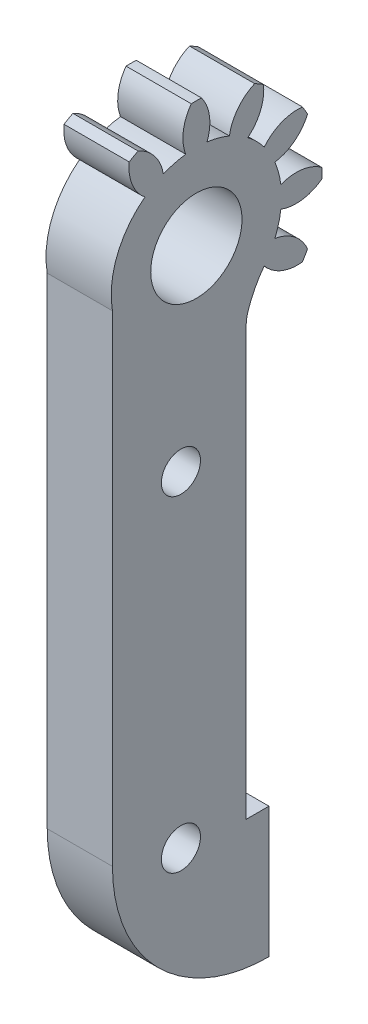
ISO-10303-21;
HEADER;
FILE_DESCRIPTION(('STEP AP214'),'2;1');
FILE_NAME('part.step','',(''),(''),'','','');
FILE_SCHEMA(('AUTOMOTIVE_DESIGN { 1 0 10303 214 1 1 1 1 }'));
ENDSEC;
DATA;
#1=APPLICATION_CONTEXT('core data for automotive mechanical design processes');
#2=APPLICATION_PROTOCOL_DEFINITION('international standard','automotive_design',2000,#1);
#3=PRODUCT_CONTEXT('',#1,'mechanical');
#4=PRODUCT('Part','Part','',(#3));
#5=PRODUCT_RELATED_PRODUCT_CATEGORY('part','',(#4));
#6=PRODUCT_DEFINITION_FORMATION('','',#4);
#7=PRODUCT_DEFINITION_CONTEXT('part definition',#1,'design');
#8=PRODUCT_DEFINITION('design','',#6,#7);
#9=PRODUCT_DEFINITION_SHAPE('','',#8);
#10=(LENGTH_UNIT() NAMED_UNIT(*) SI_UNIT(.MILLI.,.METRE.));
#11=(NAMED_UNIT(*) PLANE_ANGLE_UNIT() SI_UNIT($,.RADIAN.));
#12=(NAMED_UNIT(*) SI_UNIT($,.STERADIAN.) SOLID_ANGLE_UNIT());
#13=UNCERTAINTY_MEASURE_WITH_UNIT(LENGTH_MEASURE(1.E-05),#10,'distance_accuracy_value','');
#14=(GEOMETRIC_REPRESENTATION_CONTEXT(3) GLOBAL_UNCERTAINTY_ASSIGNED_CONTEXT((#13)) GLOBAL_UNIT_ASSIGNED_CONTEXT((#10,
#11,#12)) REPRESENTATION_CONTEXT('',''));
#15=CARTESIAN_POINT('',(0.,0.,0.));
#16=DIRECTION('',(0.,0.,1.));
#17=DIRECTION('',(1.,0.,0.));
#18=AXIS2_PLACEMENT_3D('',#15,#16,#17);
#19=CARTESIAN_POINT('',(5.,0.,0.));
#20=DIRECTION('',(-1.,0.,0.));
#21=DIRECTION('',(0.,-0.258819045102521,0.965925826289068));
#22=AXIS2_PLACEMENT_3D('',#19,#20,#21);
#23=PLANE('',#22);
#24=CARTESIAN_POINT('',(5.,-39.4107973671188,1.18520125474898));
#25=DIRECTION('',(-1.,0.,0.));
#26=DIRECTION('',(0.,0.,1.));
#27=AXIS2_PLACEMENT_3D('',#24,#25,#26);
#28=CIRCLE('',#27,1.5);
#29=CARTESIAN_POINT('',(5.,-39.4107973671188,2.68520125474898));
#30=VERTEX_POINT('',#29);
#31=EDGE_CURVE('E907',#30,#30,#28,.T.);
#32=ORIENTED_EDGE('',*,*,#31,.T.);
#33=EDGE_LOOP('',(#32));
#34=FACE_BOUND('',#33,.T.);
#35=CARTESIAN_POINT('',(5.,-14.4107973671188,1.18520125474898));
#36=DIRECTION('',(-1.,0.,0.));
#37=DIRECTION('',(0.,0.,1.));
#38=AXIS2_PLACEMENT_3D('',#35,#36,#37);
#39=CIRCLE('',#38,1.5);
#40=CARTESIAN_POINT('',(5.,-14.4107973671188,2.68520125474898));
#41=VERTEX_POINT('',#40);
#42=EDGE_CURVE('E248',#41,#41,#39,.T.);
#43=ORIENTED_EDGE('',*,*,#42,.T.);
#44=EDGE_LOOP('',(#43));
#45=FACE_BOUND('',#44,.T.);
#46=CARTESIAN_POINT('',(5.,0.,0.));
#47=DIRECTION('',(-1.,0.,0.));
#48=DIRECTION('',(0.,-0.258819045102521,0.965925826289068));
#49=AXIS2_PLACEMENT_3D('',#46,#47,#48);
#50=CIRCLE('',#49,3.5);
#51=CARTESIAN_POINT('',(5.,-0.905866657858825,3.38074039201174));
#52=VERTEX_POINT('',#51);
#53=EDGE_CURVE('E325',#52,#52,#50,.F.);
#54=ORIENTED_EDGE('',*,*,#53,.F.);
#55=EDGE_LOOP('',(#54));
#56=FACE_BOUND('',#55,.T.);
#57=CARTESIAN_POINT('',(5.,0.,0.));
#58=DIRECTION('',(-1.,0.,0.));
#59=DIRECTION('',(0.,0.707106781186549,-0.707106781186546));
#60=AXIS2_PLACEMENT_3D('',#57,#58,#59);
#61=CIRCLE('',#60,6.53025);
#62=CARTESIAN_POINT('',(5.,-1.11011254986925,6.43520125474898));
#63=VERTEX_POINT('',#62);
#64=CARTESIAN_POINT('',(5.,5.20307403430747,3.94616087558724));
#65=VERTEX_POINT('',#64);
#66=EDGE_CURVE('E253',#63,#65,#61,.T.);
#67=ORIENTED_EDGE('',*,*,#66,.F.);
#68=DIRECTION('',(0.,-1.,0.));
#69=VECTOR('',#68,1.);
#70=CARTESIAN_POINT('',(5.,-1.11011254986925,6.43520125474898));
#71=LINE('',#70,#69);
#72=CARTESIAN_POINT('',(5.,-38.,6.43520125474897));
#73=VERTEX_POINT('',#72);
#74=EDGE_CURVE('E236',#63,#73,#71,.T.);
#75=ORIENTED_EDGE('',*,*,#74,.T.);
#76=CARTESIAN_POINT('',(5.,-38.,-5.56479874525103));
#77=DIRECTION('',(1.,0.,0.));
#78=DIRECTION('',(0.,0.,-1.));
#79=AXIS2_PLACEMENT_3D('',#76,#77,#78);
#80=CIRCLE('',#79,12.);
#81=CARTESIAN_POINT('',(5.,-50.,-5.56479874525103));
#82=VERTEX_POINT('',#81);
#83=EDGE_CURVE('E247',#73,#82,#80,.T.);
#84=ORIENTED_EDGE('',*,*,#83,.T.);
#85=DIRECTION('',(0.,1.,0.));
#86=VECTOR('',#85,1.);
#87=CARTESIAN_POINT('',(5.,-40.,-5.56479874525103));
#88=LINE('',#87,#86);
#89=CARTESIAN_POINT('',(5.,-40.,-5.56479874525103));
#90=VERTEX_POINT('',#89);
#91=EDGE_CURVE('E345',#82,#90,#88,.T.);
#92=ORIENTED_EDGE('',*,*,#91,.T.);
#93=DIRECTION('',(0.,0.,1.));
#94=VECTOR('',#93,1.);
#95=CARTESIAN_POINT('',(5.,-40.,-3.81479874525103));
#96=LINE('',#95,#94);
#97=CARTESIAN_POINT('',(5.,-40.,-3.81479874525103));
#98=VERTEX_POINT('',#97);
#99=EDGE_CURVE('E342',#90,#98,#96,.T.);
#100=ORIENTED_EDGE('',*,*,#99,.T.);
#101=DIRECTION('',(0.,1.,0.));
#102=VECTOR('',#101,1.);
#103=CARTESIAN_POINT('',(5.,-40.,-3.81479874525103));
#104=LINE('',#103,#102);
#105=CARTESIAN_POINT('',(5.,-7.25745338578866,-3.81479874525103));
#106=VERTEX_POINT('',#105);
#107=EDGE_CURVE('E335',#98,#106,#104,.T.);
#108=ORIENTED_EDGE('',*,*,#107,.T.);
#109=CARTESIAN_POINT('',(5.,-7.25745338578866,-6.81479874525103));
#110=DIRECTION('',(-1.,0.,0.));
#111=DIRECTION('',(0.,0.,1.));
#112=AXIS2_PLACEMENT_3D('',#109,#110,#111);
#113=CIRCLE('',#112,3.);
#114=CARTESIAN_POINT('',(5.,-6.34363975629935,-3.95736201794461));
#115=VERTEX_POINT('',#114);
#116=EDGE_CURVE('E43',#106,#115,#113,.T.);
#117=ORIENTED_EDGE('',*,*,#116,.T.);
#118=CARTESIAN_POINT('',(5.,-8.78047610160418,-11.5771932907617));
#119=DIRECTION('',(-1.,0.,0.));
#120=DIRECTION('',(0.,0.,-1.));
#121=AXIS2_PLACEMENT_3D('',#118,#119,#120);
#122=CIRCLE('',#121,8.);
#123=CARTESIAN_POINT('',(5.,-3.94616087558719,-5.20307403430751));
#124=VERTEX_POINT('',#123);
#125=EDGE_CURVE('E256',#115,#124,#122,.T.);
#126=ORIENTED_EDGE('',*,*,#125,.T.);
#127=CARTESIAN_POINT('',(5.,-1.86722961459183,-7.76589373379014));
#128=DIRECTION('',(-1.,0.,0.));
#129=DIRECTION('',(0.,-0.707106781186554,0.707106781186541));
#130=AXIS2_PLACEMENT_3D('',#127,#128,#129);
#131=CIRCLE('',#130,3.3);
#132=CARTESIAN_POINT('',(5.,-5.14670283362097,-8.13339258504088));
#133=VERTEX_POINT('',#132);
#134=EDGE_CURVE('E380',#133,#124,#131,.T.);
#135=ORIENTED_EDGE('',*,*,#134,.F.);
#136=CARTESIAN_POINT('',(5.,0.,0.));
#137=DIRECTION('',(-1.,0.,0.));
#138=DIRECTION('',(0.,-0.258819045102521,0.965925826289068));
#139=AXIS2_PLACEMENT_3D('',#136,#137,#138);
#140=CIRCLE('',#139,9.625);
#141=CARTESIAN_POINT('',(5.,-4.47037318078674,-8.52387169216564));
#142=VERTEX_POINT('',#141);
#143=EDGE_CURVE('E308',#142,#133,#140,.T.);
#144=ORIENTED_EDGE('',*,*,#143,.F.);
#145=CARTESIAN_POINT('',(5.,-5.79184644925663,-5.50001514783033));
#146=DIRECTION('',(-1.,0.,0.));
#147=DIRECTION('',(0.,-0.965925826289071,0.258819045102511));
#148=AXIS2_PLACEMENT_3D('',#145,#146,#147);
#149=CIRCLE('',#148,3.3);
#150=CARTESIAN_POINT('',(5.,-2.53291385368778,-6.01901258283255));
#151=VERTEX_POINT('',#150);
#152=EDGE_CURVE('E362',#151,#142,#149,.T.);
#153=ORIENTED_EDGE('',*,*,#152,.F.);
#154=CARTESIAN_POINT('',(5.,0.,0.));
#155=DIRECTION('',(-1.,0.,0.));
#156=DIRECTION('',(0.,-0.965925826289071,0.258819045102511));
#157=AXIS2_PLACEMENT_3D('',#154,#155,#156);
#158=CIRCLE('',#157,6.53025);
#159=CARTESIAN_POINT('',(5.,-0.815938548524985,-6.47907472927508));
#160=VERTEX_POINT('',#159);
#161=EDGE_CURVE('E367',#160,#151,#158,.T.);
#162=ORIENTED_EDGE('',*,*,#161,.F.);
#163=CARTESIAN_POINT('',(5.,2.26587858595993,-7.65907606384856));
#164=DIRECTION('',(-1.,0.,0.));
#165=DIRECTION('',(0.,-0.965925826289071,0.258819045102511));
#166=AXIS2_PLACEMENT_3D('',#163,#164,#165);
#167=CIRCLE('',#166,3.3);
#168=CARTESIAN_POINT('',(5.,-0.390479107124668,-9.61707601440787));
#169=VERTEX_POINT('',#168);
#170=EDGE_CURVE('E364',#169,#160,#167,.T.);
#171=ORIENTED_EDGE('',*,*,#170,.F.);
#172=CARTESIAN_POINT('',(5.,0.39047910712487,-9.61707601440786));
#173=VERTEX_POINT('',#172);
#174=EDGE_CURVE('E505',#173,#169,#140,.T.);
#175=ORIENTED_EDGE('',*,*,#174,.F.);
#176=CARTESIAN_POINT('',(5.,-2.26587858595977,-7.65907606384861));
#177=DIRECTION('',(-1.,0.,0.));
#178=DIRECTION('',(0.,-0.965925826289065,-0.258819045102531));
#179=AXIS2_PLACEMENT_3D('',#176,#177,#178);
#180=CIRCLE('',#179,3.3);
#181=CARTESIAN_POINT('',(5.,0.815938548525121,-6.47907472927507));
#182=VERTEX_POINT('',#181);
#183=EDGE_CURVE('E387',#182,#173,#180,.T.);
#184=ORIENTED_EDGE('',*,*,#183,.F.);
#185=CARTESIAN_POINT('',(5.,0.,0.));
#186=DIRECTION('',(-1.,0.,0.));
#187=DIRECTION('',(0.,-0.965925826289065,-0.258819045102531));
#188=AXIS2_PLACEMENT_3D('',#185,#186,#187);
#189=CIRCLE('',#188,6.53025);
#190=CARTESIAN_POINT('',(5.,2.53291385368791,-6.0190125828325));
#191=VERTEX_POINT('',#190);
#192=EDGE_CURVE('E392',#191,#182,#189,.T.);
#193=ORIENTED_EDGE('',*,*,#192,.F.);
#194=CARTESIAN_POINT('',(5.,5.79184644925675,-5.5000151478302));
#195=DIRECTION('',(-1.,0.,0.));
#196=DIRECTION('',(0.,-0.965925826289065,-0.258819045102531));
#197=AXIS2_PLACEMENT_3D('',#194,#195,#196);
#198=CIRCLE('',#197,3.3);
#199=CARTESIAN_POINT('',(5.,4.47037318078692,-8.52387169216555));
#200=VERTEX_POINT('',#199);
#201=EDGE_CURVE('E389',#200,#191,#198,.T.);
#202=ORIENTED_EDGE('',*,*,#201,.F.);
#203=CARTESIAN_POINT('',(5.,5.14670283362114,-8.13339258504077));
#204=VERTEX_POINT('',#203);
#205=EDGE_CURVE('E484',#204,#200,#140,.T.);
#206=ORIENTED_EDGE('',*,*,#205,.F.);
#207=CARTESIAN_POINT('',(5.,1.86722961459199,-7.7658937337901));
#208=DIRECTION('',(-1.,0.,0.));
#209=DIRECTION('',(0.,-0.707106781186539,-0.707106781186556));
#210=AXIS2_PLACEMENT_3D('',#207,#208,#209);
#211=CIRCLE('',#210,3.3);
#212=CARTESIAN_POINT('',(5.,3.9461608755873,-5.20307403430743));
#213=VERTEX_POINT('',#212);
#214=EDGE_CURVE('E421',#213,#204,#211,.T.);
#215=ORIENTED_EDGE('',*,*,#214,.F.);
#216=CARTESIAN_POINT('',(5.,0.,0.));
#217=DIRECTION('',(-1.,0.,0.));
#218=DIRECTION('',(0.,-0.707106781186539,-0.707106781186556));
#219=AXIS2_PLACEMENT_3D('',#216,#217,#218);
#220=CIRCLE('',#219,6.53025);
#221=CARTESIAN_POINT('',(5.,5.20307403430752,-3.94616087558717));
#222=VERTEX_POINT('',#221);
#223=EDGE_CURVE('E426',#222,#213,#220,.T.);
#224=ORIENTED_EDGE('',*,*,#223,.F.);
#225=CARTESIAN_POINT('',(5.,7.76589373379015,-1.8672296145918));
#226=DIRECTION('',(-1.,0.,0.));
#227=DIRECTION('',(0.,-0.707106781186539,-0.707106781186556));
#228=AXIS2_PLACEMENT_3D('',#225,#226,#227);
#229=CIRCLE('',#228,3.3);
#230=CARTESIAN_POINT('',(5.,8.13339258504089,-5.14670283362094));
#231=VERTEX_POINT('',#230);
#232=EDGE_CURVE('E423',#231,#222,#229,.T.);
#233=ORIENTED_EDGE('',*,*,#232,.F.);
#234=CARTESIAN_POINT('',(5.,8.52387169216565,-4.47037318078671));
#235=VERTEX_POINT('',#234);
#236=EDGE_CURVE('E307',#235,#231,#140,.T.);
#237=ORIENTED_EDGE('',*,*,#236,.F.);
#238=CARTESIAN_POINT('',(5.,5.50001514783035,-5.79184644925661));
#239=DIRECTION('',(-1.,0.,0.));
#240=DIRECTION('',(0.,-0.258819045102508,-0.965925826289072));
#241=AXIS2_PLACEMENT_3D('',#238,#239,#240);
#242=CIRCLE('',#241,3.3);
#243=CARTESIAN_POINT('',(5.,6.01901258283256,-2.53291385368776));
#244=VERTEX_POINT('',#243);
#245=EDGE_CURVE('E404',#244,#235,#242,.T.);
#246=ORIENTED_EDGE('',*,*,#245,.F.);
#247=CARTESIAN_POINT('',(5.,0.,0.));
#248=DIRECTION('',(-1.,0.,0.));
#249=DIRECTION('',(0.,-0.258819045102508,-0.965925826289072));
#250=AXIS2_PLACEMENT_3D('',#247,#248,#249);
#251=CIRCLE('',#250,6.53025);
#252=CARTESIAN_POINT('',(5.,6.47907472927509,-0.815938548524962));
#253=VERTEX_POINT('',#252);
#254=EDGE_CURVE('E409',#253,#244,#251,.T.);
#255=ORIENTED_EDGE('',*,*,#254,.F.);
#256=CARTESIAN_POINT('',(5.,7.65907606384855,2.26587858595996));
#257=DIRECTION('',(-1.,0.,0.));
#258=DIRECTION('',(0.,-0.258819045102508,-0.965925826289072));
#259=AXIS2_PLACEMENT_3D('',#256,#257,#258);
#260=CIRCLE('',#259,3.3);
#261=CARTESIAN_POINT('',(5.,9.61707601440787,-0.390479107124634));
#262=VERTEX_POINT('',#261);
#263=EDGE_CURVE('E406',#262,#253,#260,.T.);
#264=ORIENTED_EDGE('',*,*,#263,.F.);
#265=CARTESIAN_POINT('',(5.,9.61707601440787,0.39047910712477));
#266=VERTEX_POINT('',#265);
#267=EDGE_CURVE('E303',#266,#262,#140,.T.);
#268=ORIENTED_EDGE('',*,*,#267,.F.);
#269=CARTESIAN_POINT('',(5.,7.65907606384858,-2.26587858595985));
#270=DIRECTION('',(-1.,0.,0.));
#271=DIRECTION('',(0.,0.258819045102521,-0.965925826289068));
#272=AXIS2_PLACEMENT_3D('',#269,#270,#271);
#273=CIRCLE('',#272,3.3);
#274=CARTESIAN_POINT('',(5.,6.47907472927507,0.815938548525054));
#275=VERTEX_POINT('',#274);
#276=EDGE_CURVE('E275',#275,#266,#273,.T.);
#277=ORIENTED_EDGE('',*,*,#276,.F.);
#278=CARTESIAN_POINT('',(5.,0.,0.));
#279=DIRECTION('',(-1.,0.,0.));
#280=DIRECTION('',(0.,0.258819045102521,-0.965925826289068));
#281=AXIS2_PLACEMENT_3D('',#278,#279,#280);
#282=CIRCLE('',#281,6.53025);
#283=CARTESIAN_POINT('',(5.,6.01901258283252,2.53291385368785));
#284=VERTEX_POINT('',#283);
#285=EDGE_CURVE('E280',#284,#275,#282,.T.);
#286=ORIENTED_EDGE('',*,*,#285,.F.);
#287=CARTESIAN_POINT('',(5.,5.50001514783026,5.79184644925669));
#288=DIRECTION('',(-1.,0.,0.));
#289=DIRECTION('',(0.,0.258819045102521,-0.965925826289068));
#290=AXIS2_PLACEMENT_3D('',#287,#288,#289);
#291=CIRCLE('',#290,3.3);
#292=CARTESIAN_POINT('',(5.,8.52387169216559,4.47037318078683));
#293=VERTEX_POINT('',#292);
#294=EDGE_CURVE('E277',#293,#284,#291,.T.);
#295=ORIENTED_EDGE('',*,*,#294,.F.);
#296=CARTESIAN_POINT('',(5.,8.13339258504082,5.14670283362106));
#297=VERTEX_POINT('',#296);
#298=EDGE_CURVE('E300',#297,#293,#140,.T.);
#299=ORIENTED_EDGE('',*,*,#298,.F.);
#300=CARTESIAN_POINT('',(5.,7.76589373379012,1.86722961459191));
#301=DIRECTION('',(-1.,0.,0.));
#302=DIRECTION('',(0.,0.707106781186549,-0.707106781186546));
#303=AXIS2_PLACEMENT_3D('',#300,#301,#302);
#304=CIRCLE('',#303,3.3);
#305=EDGE_CURVE('E260',#65,#297,#304,.T.);
#306=ORIENTED_EDGE('',*,*,#305,.F.);
#307=EDGE_LOOP('',(#67,#75,#84,#92,#100,#108,#117,#126,#135,#144,#153,#162,#171,#175,#184,#193,
#202,#206,#215,#224,#233,#237,#246,#255,#264,#268,#277,#286,#295,#299,#306));
#308=FACE_BOUND('',#307,.T.);
#309=ADVANCED_FACE('F35',(#34,#45,#56,#308),#23,.F.);
#310=CARTESIAN_POINT('',(0.,0.,0.));
#311=DIRECTION('',(1.,0.,0.));
#312=DIRECTION('',(0.,0.258819045102521,-0.965925826289068));
#313=AXIS2_PLACEMENT_3D('',#310,#311,#312);
#314=PLANE('',#313);
#315=CARTESIAN_POINT('',(0.,-39.4107973671188,1.18520125474898));
#316=DIRECTION('',(-1.,0.,0.));
#317=DIRECTION('',(0.,0.,1.));
#318=AXIS2_PLACEMENT_3D('',#315,#316,#317);
#319=CIRCLE('',#318,1.5);
#320=CARTESIAN_POINT('',(0.,-39.4107973671188,2.68520125474898));
#321=VERTEX_POINT('',#320);
#322=EDGE_CURVE('E910',#321,#321,#319,.T.);
#323=ORIENTED_EDGE('',*,*,#322,.F.);
#324=EDGE_LOOP('',(#323));
#325=FACE_BOUND('',#324,.T.);
#326=CARTESIAN_POINT('',(0.,-14.4107973671188,1.18520125474898));
#327=DIRECTION('',(-1.,0.,0.));
#328=DIRECTION('',(0.,0.,1.));
#329=AXIS2_PLACEMENT_3D('',#326,#327,#328);
#330=CIRCLE('',#329,1.5);
#331=CARTESIAN_POINT('',(0.,-14.4107973671188,2.68520125474898));
#332=VERTEX_POINT('',#331);
#333=EDGE_CURVE('E904',#332,#332,#330,.T.);
#334=ORIENTED_EDGE('',*,*,#333,.F.);
#335=EDGE_LOOP('',(#334));
#336=FACE_BOUND('',#335,.T.);
#337=CARTESIAN_POINT('',(0.,0.,0.));
#338=DIRECTION('',(1.,0.,0.));
#339=DIRECTION('',(0.,0.258819045102521,-0.965925826289068));
#340=AXIS2_PLACEMENT_3D('',#337,#338,#339);
#341=CIRCLE('',#340,3.5);
#342=CARTESIAN_POINT('',(0.,0.905866657858825,-3.38074039201174));
#343=VERTEX_POINT('',#342);
#344=EDGE_CURVE('E322',#343,#343,#341,.F.);
#345=ORIENTED_EDGE('',*,*,#344,.F.);
#346=EDGE_LOOP('',(#345));
#347=FACE_BOUND('',#346,.T.);
#348=CARTESIAN_POINT('',(0.,-1.86722961459183,-7.76589373379014));
#349=DIRECTION('',(1.,0.,0.));
#350=DIRECTION('',(0.,0.258819045102521,-0.965925826289068));
#351=AXIS2_PLACEMENT_3D('',#348,#349,#350);
#352=CIRCLE('',#351,3.3);
#353=CARTESIAN_POINT('',(0.,-3.94616087558719,-5.20307403430751));
#354=VERTEX_POINT('',#353);
#355=CARTESIAN_POINT('',(0.,-5.14670283362097,-8.13339258504088));
#356=VERTEX_POINT('',#355);
#357=EDGE_CURVE('E317',#354,#356,#352,.T.);
#358=ORIENTED_EDGE('',*,*,#357,.F.);
#359=CARTESIAN_POINT('',(0.,-8.78047610160418,-11.5771932907617));
#360=DIRECTION('',(1.,0.,0.));
#361=DIRECTION('',(0.,0.,-1.));
#362=AXIS2_PLACEMENT_3D('',#359,#360,#361);
#363=CIRCLE('',#362,8.);
#364=CARTESIAN_POINT('',(0.,-6.34363975629935,-3.95736201794461));
#365=VERTEX_POINT('',#364);
#366=EDGE_CURVE('E358',#354,#365,#363,.T.);
#367=ORIENTED_EDGE('',*,*,#366,.T.);
#368=CARTESIAN_POINT('',(0.,-7.25745338578866,-6.81479874525103));
#369=DIRECTION('',(1.,0.,0.));
#370=DIRECTION('',(0.,0.,-1.));
#371=AXIS2_PLACEMENT_3D('',#368,#369,#370);
#372=CIRCLE('',#371,3.);
#373=CARTESIAN_POINT('',(0.,-7.25745338578866,-3.81479874525103));
#374=VERTEX_POINT('',#373);
#375=EDGE_CURVE('E11',#365,#374,#372,.T.);
#376=ORIENTED_EDGE('',*,*,#375,.T.);
#377=DIRECTION('',(0.,-1.,0.));
#378=VECTOR('',#377,1.);
#379=CARTESIAN_POINT('',(0.,-40.,-3.81479874525103));
#380=LINE('',#379,#378);
#381=CARTESIAN_POINT('',(0.,-40.,-3.81479874525103));
#382=VERTEX_POINT('',#381);
#383=EDGE_CURVE('E337',#374,#382,#380,.T.);
#384=ORIENTED_EDGE('',*,*,#383,.T.);
#385=DIRECTION('',(0.,0.,-1.));
#386=VECTOR('',#385,1.);
#387=CARTESIAN_POINT('',(0.,-40.,-3.81479874525103));
#388=LINE('',#387,#386);
#389=CARTESIAN_POINT('',(0.,-40.,-5.56479874525103));
#390=VERTEX_POINT('',#389);
#391=EDGE_CURVE('E891',#382,#390,#388,.T.);
#392=ORIENTED_EDGE('',*,*,#391,.T.);
#393=DIRECTION('',(0.,-1.,0.));
#394=VECTOR('',#393,1.);
#395=CARTESIAN_POINT('',(0.,-40.,-5.56479874525103));
#396=LINE('',#395,#394);
#397=CARTESIAN_POINT('',(0.,-50.,-5.56479874525103));
#398=VERTEX_POINT('',#397);
#399=EDGE_CURVE('E899',#390,#398,#396,.T.);
#400=ORIENTED_EDGE('',*,*,#399,.T.);
#401=CARTESIAN_POINT('',(0.,-38.,-5.56479874525103));
#402=DIRECTION('',(1.,0.,0.));
#403=DIRECTION('',(0.,0.,-1.));
#404=AXIS2_PLACEMENT_3D('',#401,#402,#403);
#405=CIRCLE('',#404,12.);
#406=CARTESIAN_POINT('',(0.,-38.,6.43520125474897));
#407=VERTEX_POINT('',#406);
#408=EDGE_CURVE('E351',#398,#407,#405,.F.);
#409=ORIENTED_EDGE('',*,*,#408,.T.);
#410=DIRECTION('',(0.,1.,0.));
#411=VECTOR('',#410,1.);
#412=CARTESIAN_POINT('',(0.,-1.11011254986925,6.43520125474898));
#413=LINE('',#412,#411);
#414=CARTESIAN_POINT('',(0.,-1.11011254986925,6.43520125474898));
#415=VERTEX_POINT('',#414);
#416=EDGE_CURVE('E326',#407,#415,#413,.T.);
#417=ORIENTED_EDGE('',*,*,#416,.T.);
#418=CARTESIAN_POINT('',(0.,0.,0.));
#419=DIRECTION('',(-1.,0.,0.));
#420=DIRECTION('',(0.,0.707106781186549,-0.707106781186546));
#421=AXIS2_PLACEMENT_3D('',#418,#419,#420);
#422=CIRCLE('',#421,6.53025);
#423=CARTESIAN_POINT('',(0.,5.20307403430747,3.94616087558724));
#424=VERTEX_POINT('',#423);
#425=EDGE_CURVE('E255',#415,#424,#422,.T.);
#426=ORIENTED_EDGE('',*,*,#425,.T.);
#427=CARTESIAN_POINT('',(0.,7.76589373379012,1.86722961459191));
#428=DIRECTION('',(-1.,0.,0.));
#429=DIRECTION('',(0.,0.707106781186549,-0.707106781186546));
#430=AXIS2_PLACEMENT_3D('',#427,#428,#429);
#431=CIRCLE('',#430,3.3);
#432=CARTESIAN_POINT('',(0.,8.13339258504082,5.14670283362106));
#433=VERTEX_POINT('',#432);
#434=EDGE_CURVE('E268',#424,#433,#431,.T.);
#435=ORIENTED_EDGE('',*,*,#434,.T.);
#436=CARTESIAN_POINT('',(0.,0.,0.));
#437=DIRECTION('',(-1.,0.,0.));
#438=DIRECTION('',(0.,-0.258819045102521,0.965925826289068));
#439=AXIS2_PLACEMENT_3D('',#436,#437,#438);
#440=CIRCLE('',#439,9.625);
#441=CARTESIAN_POINT('',(0.,8.52387169216559,4.47037318078683));
#442=VERTEX_POINT('',#441);
#443=EDGE_CURVE('E296',#433,#442,#440,.T.);
#444=ORIENTED_EDGE('',*,*,#443,.T.);
#445=CARTESIAN_POINT('',(0.,5.50001514783026,5.79184644925669));
#446=DIRECTION('',(1.,0.,0.));
#447=DIRECTION('',(0.,0.258819045102521,-0.965925826289068));
#448=AXIS2_PLACEMENT_3D('',#445,#446,#447);
#449=CIRCLE('',#448,3.3);
#450=CARTESIAN_POINT('',(0.,6.01901258283252,2.53291385368785));
#451=VERTEX_POINT('',#450);
#452=EDGE_CURVE('E306',#451,#442,#449,.T.);
#453=ORIENTED_EDGE('',*,*,#452,.F.);
#454=CARTESIAN_POINT('',(0.,0.,0.));
#455=DIRECTION('',(-1.,0.,0.));
#456=DIRECTION('',(0.,0.258819045102521,-0.965925826289068));
#457=AXIS2_PLACEMENT_3D('',#454,#455,#456);
#458=CIRCLE('',#457,6.53025);
#459=CARTESIAN_POINT('',(0.,6.47907472927507,0.815938548525054));
#460=VERTEX_POINT('',#459);
#461=EDGE_CURVE('E278',#451,#460,#458,.T.);
#462=ORIENTED_EDGE('',*,*,#461,.T.);
#463=CARTESIAN_POINT('',(0.,7.65907606384858,-2.26587858595985));
#464=DIRECTION('',(-1.,0.,0.));
#465=DIRECTION('',(0.,0.258819045102521,-0.965925826289068));
#466=AXIS2_PLACEMENT_3D('',#463,#464,#465);
#467=CIRCLE('',#466,3.3);
#468=CARTESIAN_POINT('',(0.,9.61707601440786,0.39047910712477));
#469=VERTEX_POINT('',#468);
#470=EDGE_CURVE('E274',#460,#469,#467,.T.);
#471=ORIENTED_EDGE('',*,*,#470,.T.);
#472=CARTESIAN_POINT('',(0.,9.61707601440787,-0.390479107124634));
#473=VERTEX_POINT('',#472);
#474=EDGE_CURVE('E297',#469,#473,#440,.T.);
#475=ORIENTED_EDGE('',*,*,#474,.T.);
#476=CARTESIAN_POINT('',(0.,7.65907606384855,2.26587858595996));
#477=DIRECTION('',(1.,0.,0.));
#478=DIRECTION('',(0.,0.258819045102521,-0.965925826289068));
#479=AXIS2_PLACEMENT_3D('',#476,#477,#478);
#480=CIRCLE('',#479,3.3);
#481=CARTESIAN_POINT('',(0.,6.47907472927509,-0.815938548524962));
#482=VERTEX_POINT('',#481);
#483=EDGE_CURVE('E313',#482,#473,#480,.T.);
#484=ORIENTED_EDGE('',*,*,#483,.F.);
#485=CARTESIAN_POINT('',(0.,0.,0.));
#486=DIRECTION('',(-1.,0.,0.));
#487=DIRECTION('',(0.,-0.258819045102508,-0.965925826289072));
#488=AXIS2_PLACEMENT_3D('',#485,#486,#487);
#489=CIRCLE('',#488,6.53025);
#490=CARTESIAN_POINT('',(0.,6.01901258283256,-2.53291385368776));
#491=VERTEX_POINT('',#490);
#492=EDGE_CURVE('E407',#482,#491,#489,.T.);
#493=ORIENTED_EDGE('',*,*,#492,.T.);
#494=CARTESIAN_POINT('',(0.,5.50001514783035,-5.79184644925661));
#495=DIRECTION('',(-1.,0.,0.));
#496=DIRECTION('',(0.,-0.258819045102508,-0.965925826289072));
#497=AXIS2_PLACEMENT_3D('',#494,#495,#496);
#498=CIRCLE('',#497,3.3);
#499=CARTESIAN_POINT('',(0.,8.52387169216565,-4.47037318078671));
#500=VERTEX_POINT('',#499);
#501=EDGE_CURVE('E361',#491,#500,#498,.T.);
#502=ORIENTED_EDGE('',*,*,#501,.T.);
#503=CARTESIAN_POINT('',(0.,8.13339258504089,-5.14670283362094));
#504=VERTEX_POINT('',#503);
#505=EDGE_CURVE('E301',#500,#504,#440,.T.);
#506=ORIENTED_EDGE('',*,*,#505,.T.);
#507=CARTESIAN_POINT('',(0.,7.76589373379015,-1.8672296145918));
#508=DIRECTION('',(1.,0.,0.));
#509=DIRECTION('',(0.,0.258819045102521,-0.965925826289068));
#510=AXIS2_PLACEMENT_3D('',#507,#508,#509);
#511=CIRCLE('',#510,3.3);
#512=CARTESIAN_POINT('',(0.,5.20307403430752,-3.94616087558717));
#513=VERTEX_POINT('',#512);
#514=EDGE_CURVE('E311',#513,#504,#511,.T.);
#515=ORIENTED_EDGE('',*,*,#514,.F.);
#516=CARTESIAN_POINT('',(0.,0.,0.));
#517=DIRECTION('',(-1.,0.,0.));
#518=DIRECTION('',(0.,-0.707106781186539,-0.707106781186556));
#519=AXIS2_PLACEMENT_3D('',#516,#517,#518);
#520=CIRCLE('',#519,6.53025);
#521=CARTESIAN_POINT('',(0.,3.9461608755873,-5.20307403430743));
#522=VERTEX_POINT('',#521);
#523=EDGE_CURVE('E424',#513,#522,#520,.T.);
#524=ORIENTED_EDGE('',*,*,#523,.T.);
#525=CARTESIAN_POINT('',(0.,1.86722961459199,-7.7658937337901));
#526=DIRECTION('',(-1.,0.,0.));
#527=DIRECTION('',(0.,-0.707106781186539,-0.707106781186556));
#528=AXIS2_PLACEMENT_3D('',#525,#526,#527);
#529=CIRCLE('',#528,3.3);
#530=CARTESIAN_POINT('',(0.,5.14670283362114,-8.13339258504076));
#531=VERTEX_POINT('',#530);
#532=EDGE_CURVE('E420',#522,#531,#529,.T.);
#533=ORIENTED_EDGE('',*,*,#532,.T.);
#534=CARTESIAN_POINT('',(0.,4.47037318078692,-8.52387169216555));
#535=VERTEX_POINT('',#534);
#536=EDGE_CURVE('E469',#531,#535,#440,.T.);
#537=ORIENTED_EDGE('',*,*,#536,.T.);
#538=CARTESIAN_POINT('',(0.,5.79184644925675,-5.5000151478302));
#539=DIRECTION('',(1.,0.,0.));
#540=DIRECTION('',(0.,0.258819045102521,-0.965925826289068));
#541=AXIS2_PLACEMENT_3D('',#538,#539,#540);
#542=CIRCLE('',#541,3.3);
#543=CARTESIAN_POINT('',(0.,2.53291385368791,-6.0190125828325));
#544=VERTEX_POINT('',#543);
#545=EDGE_CURVE('E315',#544,#535,#542,.T.);
#546=ORIENTED_EDGE('',*,*,#545,.F.);
#547=CARTESIAN_POINT('',(0.,0.,0.));
#548=DIRECTION('',(-1.,0.,0.));
#549=DIRECTION('',(0.,-0.965925826289065,-0.258819045102531));
#550=AXIS2_PLACEMENT_3D('',#547,#548,#549);
#551=CIRCLE('',#550,6.53025);
#552=CARTESIAN_POINT('',(0.,0.815938548525121,-6.47907472927507));
#553=VERTEX_POINT('',#552);
#554=EDGE_CURVE('E390',#544,#553,#551,.T.);
#555=ORIENTED_EDGE('',*,*,#554,.T.);
#556=CARTESIAN_POINT('',(0.,-2.26587858595977,-7.65907606384861));
#557=DIRECTION('',(-1.,0.,0.));
#558=DIRECTION('',(0.,-0.965925826289065,-0.258819045102531));
#559=AXIS2_PLACEMENT_3D('',#556,#557,#558);
#560=CIRCLE('',#559,3.3);
#561=CARTESIAN_POINT('',(0.,0.390479107124871,-9.61707601440786));
#562=VERTEX_POINT('',#561);
#563=EDGE_CURVE('E395',#553,#562,#560,.T.);
#564=ORIENTED_EDGE('',*,*,#563,.T.);
#565=CARTESIAN_POINT('',(0.,-0.390479107124669,-9.61707601440787));
#566=VERTEX_POINT('',#565);
#567=EDGE_CURVE('E467',#562,#566,#440,.T.);
#568=ORIENTED_EDGE('',*,*,#567,.T.);
#569=CARTESIAN_POINT('',(0.,2.26587858595993,-7.65907606384856));
#570=DIRECTION('',(1.,0.,0.));
#571=DIRECTION('',(0.,0.258819045102521,-0.965925826289068));
#572=AXIS2_PLACEMENT_3D('',#569,#570,#571);
#573=CIRCLE('',#572,3.3);
#574=CARTESIAN_POINT('',(0.,-0.815938548524985,-6.47907472927508));
#575=VERTEX_POINT('',#574);
#576=EDGE_CURVE('E319',#575,#566,#573,.T.);
#577=ORIENTED_EDGE('',*,*,#576,.F.);
#578=CARTESIAN_POINT('',(0.,0.,0.));
#579=DIRECTION('',(-1.,0.,0.));
#580=DIRECTION('',(0.,-0.965925826289071,0.258819045102511));
#581=AXIS2_PLACEMENT_3D('',#578,#579,#580);
#582=CIRCLE('',#581,6.53025);
#583=CARTESIAN_POINT('',(0.,-2.53291385368778,-6.01901258283255));
#584=VERTEX_POINT('',#583);
#585=EDGE_CURVE('E365',#575,#584,#582,.T.);
#586=ORIENTED_EDGE('',*,*,#585,.T.);
#587=CARTESIAN_POINT('',(0.,-5.79184644925663,-5.50001514783033));
#588=DIRECTION('',(-1.,0.,0.));
#589=DIRECTION('',(0.,-0.965925826289071,0.258819045102511));
#590=AXIS2_PLACEMENT_3D('',#587,#588,#589);
#591=CIRCLE('',#590,3.3);
#592=CARTESIAN_POINT('',(0.,-4.47037318078674,-8.52387169216564));
#593=VERTEX_POINT('',#592);
#594=EDGE_CURVE('E370',#584,#593,#591,.T.);
#595=ORIENTED_EDGE('',*,*,#594,.T.);
#596=EDGE_CURVE('E302',#593,#356,#440,.T.);
#597=ORIENTED_EDGE('',*,*,#596,.T.);
#598=EDGE_LOOP('',(#358,#367,#376,#384,#392,#400,#409,#417,#426,#435,#444,#453,#462,#471,#475,
#484,#493,#502,#506,#515,#524,#533,#537,#546,#555,#564,#568,#577,#586,#595,#597));
#599=FACE_BOUND('',#598,.T.);
#600=ADVANCED_FACE('F462',(#325,#336,#347,#599),#314,.F.);
#601=CARTESIAN_POINT('',(-10.,0.,0.));
#602=DIRECTION('',(-1.,0.,0.));
#603=DIRECTION('',(0.,-0.258819045102521,0.965925826289068));
#604=AXIS2_PLACEMENT_3D('',#601,#602,#603);
#605=CYLINDRICAL_SURFACE('',#604,9.625);
#606=DIRECTION('',(-1.,0.,0.));
#607=VECTOR('',#606,1.);
#608=CARTESIAN_POINT('',(2.5,-4.47037318078674,-8.52387169216564));
#609=LINE('',#608,#607);
#610=EDGE_CURVE('E271',#142,#593,#609,.T.);
#611=ORIENTED_EDGE('',*,*,#610,.F.);
#612=ORIENTED_EDGE('',*,*,#143,.T.);
#613=DIRECTION('',(-1.,0.,0.));
#614=VECTOR('',#613,1.);
#615=CARTESIAN_POINT('',(2.5,-5.14670283362097,-8.13339258504088));
#616=LINE('',#615,#614);
#617=EDGE_CURVE('E447',#356,#133,#616,.F.);
#618=ORIENTED_EDGE('',*,*,#617,.F.);
#619=ORIENTED_EDGE('',*,*,#596,.F.);
#620=EDGE_LOOP('',(#611,#612,#618,#619));
#621=FACE_BOUND('',#620,.T.);
#622=ADVANCED_FACE('F466',(#621),#605,.T.);
#623=DIRECTION('',(-1.,0.,0.));
#624=VECTOR('',#623,1.);
#625=CARTESIAN_POINT('',(2.5,-0.39047910712467,-9.61707601440787));
#626=LINE('',#625,#624);
#627=EDGE_CURVE('E449',#566,#169,#626,.F.);
#628=ORIENTED_EDGE('',*,*,#627,.F.);
#629=ORIENTED_EDGE('',*,*,#567,.F.);
#630=DIRECTION('',(-1.,0.,0.));
#631=VECTOR('',#630,1.);
#632=CARTESIAN_POINT('',(2.5,0.390479107124871,-9.61707601440786));
#633=LINE('',#632,#631);
#634=EDGE_CURVE('E445',#173,#562,#633,.T.);
#635=ORIENTED_EDGE('',*,*,#634,.F.);
#636=ORIENTED_EDGE('',*,*,#174,.T.);
#637=EDGE_LOOP('',(#628,#629,#635,#636));
#638=FACE_BOUND('',#637,.T.);
#639=ADVANCED_FACE('F503',(#638),#605,.T.);
#640=DIRECTION('',(-1.,0.,0.));
#641=VECTOR('',#640,1.);
#642=CARTESIAN_POINT('',(2.5,4.47037318078692,-8.52387169216555));
#643=LINE('',#642,#641);
#644=EDGE_CURVE('E443',#535,#200,#643,.F.);
#645=ORIENTED_EDGE('',*,*,#644,.F.);
#646=ORIENTED_EDGE('',*,*,#536,.F.);
#647=DIRECTION('',(-1.,0.,0.));
#648=VECTOR('',#647,1.);
#649=CARTESIAN_POINT('',(2.5,5.14670283362114,-8.13339258504076));
#650=LINE('',#649,#648);
#651=EDGE_CURVE('E437',#204,#531,#650,.T.);
#652=ORIENTED_EDGE('',*,*,#651,.F.);
#653=ORIENTED_EDGE('',*,*,#205,.T.);
#654=EDGE_LOOP('',(#645,#646,#652,#653));
#655=FACE_BOUND('',#654,.T.);
#656=ADVANCED_FACE('F481',(#655),#605,.T.);
#657=DIRECTION('',(-1.,0.,0.));
#658=VECTOR('',#657,1.);
#659=CARTESIAN_POINT('',(2.5,8.52387169216565,-4.47037318078671));
#660=LINE('',#659,#658);
#661=EDGE_CURVE('E441',#235,#500,#660,.T.);
#662=ORIENTED_EDGE('',*,*,#661,.F.);
#663=ORIENTED_EDGE('',*,*,#236,.T.);
#664=DIRECTION('',(-1.,0.,0.));
#665=VECTOR('',#664,1.);
#666=CARTESIAN_POINT('',(2.5,8.13339258504089,-5.14670283362094));
#667=LINE('',#666,#665);
#668=EDGE_CURVE('E386',#504,#231,#667,.F.);
#669=ORIENTED_EDGE('',*,*,#668,.F.);
#670=ORIENTED_EDGE('',*,*,#505,.F.);
#671=EDGE_LOOP('',(#662,#663,#669,#670));
#672=FACE_BOUND('',#671,.T.);
#673=ADVANCED_FACE('F727',(#672),#605,.T.);
#674=DIRECTION('',(-1.,0.,0.));
#675=VECTOR('',#674,1.);
#676=CARTESIAN_POINT('',(2.5,9.61707601440787,-0.390479107124634));
#677=LINE('',#676,#675);
#678=EDGE_CURVE('E439',#473,#262,#677,.F.);
#679=ORIENTED_EDGE('',*,*,#678,.F.);
#680=ORIENTED_EDGE('',*,*,#474,.F.);
#681=DIRECTION('',(-1.,0.,0.));
#682=VECTOR('',#681,1.);
#683=CARTESIAN_POINT('',(2.5,9.61707601440786,0.39047910712477));
#684=LINE('',#683,#682);
#685=EDGE_CURVE('E294',#266,#469,#684,.T.);
#686=ORIENTED_EDGE('',*,*,#685,.F.);
#687=ORIENTED_EDGE('',*,*,#267,.T.);
#688=EDGE_LOOP('',(#679,#680,#686,#687));
#689=FACE_BOUND('',#688,.T.);
#690=ADVANCED_FACE('F538',(#689),#605,.T.);
#691=DIRECTION('',(-1.,0.,0.));
#692=VECTOR('',#691,1.);
#693=CARTESIAN_POINT('',(2.5,8.13339258504082,5.14670283362106));
#694=LINE('',#693,#692);
#695=EDGE_CURVE('E263',#297,#433,#694,.T.);
#696=ORIENTED_EDGE('',*,*,#695,.F.);
#697=ORIENTED_EDGE('',*,*,#298,.T.);
#698=DIRECTION('',(-1.,0.,0.));
#699=VECTOR('',#698,1.);
#700=CARTESIAN_POINT('',(2.5,8.52387169216559,4.47037318078683));
#701=LINE('',#700,#699);
#702=EDGE_CURVE('E291',#442,#293,#701,.F.);
#703=ORIENTED_EDGE('',*,*,#702,.F.);
#704=ORIENTED_EDGE('',*,*,#443,.F.);
#705=EDGE_LOOP('',(#696,#697,#703,#704));
#706=FACE_BOUND('',#705,.T.);
#707=ADVANCED_FACE('F535',(#706),#605,.T.);
#708=CARTESIAN_POINT('',(5.,7.65907606384858,-2.26587858595985));
#709=DIRECTION('',(-1.,0.,0.));
#710=DIRECTION('',(0.,-0.258819045102521,0.965925826289068));
#711=AXIS2_PLACEMENT_3D('',#708,#709,#710);
#712=CYLINDRICAL_SURFACE('',#711,3.3);
#713=ORIENTED_EDGE('',*,*,#685,.T.);
#714=ORIENTED_EDGE('',*,*,#470,.F.);
#715=DIRECTION('',(-1.,0.,0.));
#716=VECTOR('',#715,1.);
#717=CARTESIAN_POINT('',(5.,6.47907472927507,0.815938548525054));
#718=LINE('',#717,#716);
#719=EDGE_CURVE('E282',#275,#460,#718,.T.);
#720=ORIENTED_EDGE('',*,*,#719,.F.);
#721=ORIENTED_EDGE('',*,*,#276,.T.);
#722=EDGE_LOOP('',(#713,#714,#720,#721));
#723=FACE_BOUND('',#722,.T.);
#724=ADVANCED_FACE('F537',(#723),#712,.T.);
#725=CARTESIAN_POINT('',(5.,5.50001514783026,5.79184644925669));
#726=DIRECTION('',(-1.,0.,0.));
#727=DIRECTION('',(0.,-0.258819045102521,0.965925826289068));
#728=AXIS2_PLACEMENT_3D('',#725,#726,#727);
#729=CYLINDRICAL_SURFACE('',#728,3.3);
#730=ORIENTED_EDGE('',*,*,#702,.T.);
#731=ORIENTED_EDGE('',*,*,#294,.T.);
#732=DIRECTION('',(-1.,0.,0.));
#733=VECTOR('',#732,1.);
#734=CARTESIAN_POINT('',(5.,6.01901258283252,2.53291385368785));
#735=LINE('',#734,#733);
#736=EDGE_CURVE('E289',#284,#451,#735,.T.);
#737=ORIENTED_EDGE('',*,*,#736,.T.);
#738=ORIENTED_EDGE('',*,*,#452,.T.);
#739=EDGE_LOOP('',(#730,#731,#737,#738));
#740=FACE_BOUND('',#739,.T.);
#741=ADVANCED_FACE('F543',(#740),#729,.T.);
#742=CARTESIAN_POINT('',(5.,0.,0.));
#743=DIRECTION('',(-1.,0.,0.));
#744=DIRECTION('',(0.,-0.258819045102521,0.965925826289068));
#745=AXIS2_PLACEMENT_3D('',#742,#743,#744);
#746=CYLINDRICAL_SURFACE('',#745,6.53025);
#747=ORIENTED_EDGE('',*,*,#461,.F.);
#748=ORIENTED_EDGE('',*,*,#736,.F.);
#749=ORIENTED_EDGE('',*,*,#285,.T.);
#750=ORIENTED_EDGE('',*,*,#719,.T.);
#751=EDGE_LOOP('',(#747,#748,#749,#750));
#752=FACE_BOUND('',#751,.T.);
#753=ADVANCED_FACE('F547',(#752),#746,.T.);
#754=CARTESIAN_POINT('',(5.,7.76589373379012,1.86722961459191));
#755=DIRECTION('',(-1.,0.,0.));
#756=DIRECTION('',(0.,-0.258819045102521,0.965925826289068));
#757=AXIS2_PLACEMENT_3D('',#754,#755,#756);
#758=CYLINDRICAL_SURFACE('',#757,3.3);
#759=ORIENTED_EDGE('',*,*,#695,.T.);
#760=ORIENTED_EDGE('',*,*,#434,.F.);
#761=DIRECTION('',(-1.,0.,0.));
#762=VECTOR('',#761,1.);
#763=CARTESIAN_POINT('',(5.,5.20307403430747,3.94616087558724));
#764=LINE('',#763,#762);
#765=EDGE_CURVE('E261',#65,#424,#764,.T.);
#766=ORIENTED_EDGE('',*,*,#765,.F.);
#767=ORIENTED_EDGE('',*,*,#305,.T.);
#768=EDGE_LOOP('',(#759,#760,#766,#767));
#769=FACE_BOUND('',#768,.T.);
#770=ADVANCED_FACE('F551',(#769),#758,.T.);
#771=CARTESIAN_POINT('',(5.,0.,0.));
#772=DIRECTION('',(-1.,0.,0.));
#773=DIRECTION('',(0.,-0.258819045102521,0.965925826289068));
#774=AXIS2_PLACEMENT_3D('',#771,#772,#773);
#775=CYLINDRICAL_SURFACE('',#774,6.53025);
#776=DIRECTION('',(1.,0.,0.));
#777=VECTOR('',#776,1.);
#778=CARTESIAN_POINT('',(-50.3410478127587,-1.11011254986925,6.43520125474898));
#779=LINE('',#778,#777);
#780=EDGE_CURVE('E240',#415,#63,#779,.T.);
#781=ORIENTED_EDGE('',*,*,#780,.T.);
#782=ORIENTED_EDGE('',*,*,#66,.T.);
#783=ORIENTED_EDGE('',*,*,#765,.T.);
#784=ORIENTED_EDGE('',*,*,#425,.F.);
#785=EDGE_LOOP('',(#781,#782,#783,#784));
#786=FACE_BOUND('',#785,.T.);
#787=ADVANCED_FACE('F251',(#786),#775,.T.);
#788=CARTESIAN_POINT('',(5.,1.86722961459199,-7.7658937337901));
#789=DIRECTION('',(-1.,0.,0.));
#790=DIRECTION('',(0.,-0.258819045102521,0.965925826289068));
#791=AXIS2_PLACEMENT_3D('',#788,#789,#790);
#792=CYLINDRICAL_SURFACE('',#791,3.3);
#793=ORIENTED_EDGE('',*,*,#651,.T.);
#794=ORIENTED_EDGE('',*,*,#532,.F.);
#795=DIRECTION('',(-1.,0.,0.));
#796=VECTOR('',#795,1.);
#797=CARTESIAN_POINT('',(5.,3.9461608755873,-5.20307403430743));
#798=LINE('',#797,#796);
#799=EDGE_CURVE('E428',#213,#522,#798,.T.);
#800=ORIENTED_EDGE('',*,*,#799,.F.);
#801=ORIENTED_EDGE('',*,*,#214,.T.);
#802=EDGE_LOOP('',(#793,#794,#800,#801));
#803=FACE_BOUND('',#802,.T.);
#804=ADVANCED_FACE('F558',(#803),#792,.T.);
#805=CARTESIAN_POINT('',(5.,7.76589373379015,-1.8672296145918));
#806=DIRECTION('',(-1.,0.,0.));
#807=DIRECTION('',(0.,-0.258819045102521,0.965925826289068));
#808=AXIS2_PLACEMENT_3D('',#805,#806,#807);
#809=CYLINDRICAL_SURFACE('',#808,3.3);
#810=ORIENTED_EDGE('',*,*,#668,.T.);
#811=ORIENTED_EDGE('',*,*,#232,.T.);
#812=DIRECTION('',(-1.,0.,0.));
#813=VECTOR('',#812,1.);
#814=CARTESIAN_POINT('',(5.,5.20307403430752,-3.94616087558717));
#815=LINE('',#814,#813);
#816=EDGE_CURVE('E398',#222,#513,#815,.T.);
#817=ORIENTED_EDGE('',*,*,#816,.T.);
#818=ORIENTED_EDGE('',*,*,#514,.T.);
#819=EDGE_LOOP('',(#810,#811,#817,#818));
#820=FACE_BOUND('',#819,.T.);
#821=ADVANCED_FACE('F561',(#820),#809,.T.);
#822=CARTESIAN_POINT('',(5.,0.,0.));
#823=DIRECTION('',(-1.,0.,0.));
#824=DIRECTION('',(0.,-0.258819045102521,0.965925826289068));
#825=AXIS2_PLACEMENT_3D('',#822,#823,#824);
#826=CYLINDRICAL_SURFACE('',#825,6.53025);
#827=ORIENTED_EDGE('',*,*,#523,.F.);
#828=ORIENTED_EDGE('',*,*,#816,.F.);
#829=ORIENTED_EDGE('',*,*,#223,.T.);
#830=ORIENTED_EDGE('',*,*,#799,.T.);
#831=EDGE_LOOP('',(#827,#828,#829,#830));
#832=FACE_BOUND('',#831,.T.);
#833=ADVANCED_FACE('F565',(#832),#826,.T.);
#834=CARTESIAN_POINT('',(5.,5.50001514783035,-5.79184644925661));
#835=DIRECTION('',(-1.,0.,0.));
#836=DIRECTION('',(0.,-0.258819045102521,0.965925826289068));
#837=AXIS2_PLACEMENT_3D('',#834,#835,#836);
#838=CYLINDRICAL_SURFACE('',#837,3.3);
#839=ORIENTED_EDGE('',*,*,#661,.T.);
#840=ORIENTED_EDGE('',*,*,#501,.F.);
#841=DIRECTION('',(-1.,0.,0.));
#842=VECTOR('',#841,1.);
#843=CARTESIAN_POINT('',(5.,6.01901258283256,-2.53291385368776));
#844=LINE('',#843,#842);
#845=EDGE_CURVE('E411',#244,#491,#844,.T.);
#846=ORIENTED_EDGE('',*,*,#845,.F.);
#847=ORIENTED_EDGE('',*,*,#245,.T.);
#848=EDGE_LOOP('',(#839,#840,#846,#847));
#849=FACE_BOUND('',#848,.T.);
#850=ADVANCED_FACE('F569',(#849),#838,.T.);
#851=CARTESIAN_POINT('',(5.,7.65907606384855,2.26587858595996));
#852=DIRECTION('',(-1.,0.,0.));
#853=DIRECTION('',(0.,-0.258819045102521,0.965925826289068));
#854=AXIS2_PLACEMENT_3D('',#851,#852,#853);
#855=CYLINDRICAL_SURFACE('',#854,3.3);
#856=ORIENTED_EDGE('',*,*,#678,.T.);
#857=ORIENTED_EDGE('',*,*,#263,.T.);
#858=DIRECTION('',(-1.,0.,0.));
#859=VECTOR('',#858,1.);
#860=CARTESIAN_POINT('',(5.,6.47907472927509,-0.815938548524962));
#861=LINE('',#860,#859);
#862=EDGE_CURVE('E418',#253,#482,#861,.T.);
#863=ORIENTED_EDGE('',*,*,#862,.T.);
#864=ORIENTED_EDGE('',*,*,#483,.T.);
#865=EDGE_LOOP('',(#856,#857,#863,#864));
#866=FACE_BOUND('',#865,.T.);
#867=ADVANCED_FACE('F573',(#866),#855,.T.);
#868=CARTESIAN_POINT('',(5.,0.,0.));
#869=DIRECTION('',(-1.,0.,0.));
#870=DIRECTION('',(0.,-0.258819045102521,0.965925826289068));
#871=AXIS2_PLACEMENT_3D('',#868,#869,#870);
#872=CYLINDRICAL_SURFACE('',#871,6.53025);
#873=ORIENTED_EDGE('',*,*,#492,.F.);
#874=ORIENTED_EDGE('',*,*,#862,.F.);
#875=ORIENTED_EDGE('',*,*,#254,.T.);
#876=ORIENTED_EDGE('',*,*,#845,.T.);
#877=EDGE_LOOP('',(#873,#874,#875,#876));
#878=FACE_BOUND('',#877,.T.);
#879=ADVANCED_FACE('F577',(#878),#872,.T.);
#880=CARTESIAN_POINT('',(5.,-2.26587858595977,-7.65907606384861));
#881=DIRECTION('',(-1.,0.,0.));
#882=DIRECTION('',(0.,-0.258819045102521,0.965925826289068));
#883=AXIS2_PLACEMENT_3D('',#880,#881,#882);
#884=CYLINDRICAL_SURFACE('',#883,3.3);
#885=ORIENTED_EDGE('',*,*,#634,.T.);
#886=ORIENTED_EDGE('',*,*,#563,.F.);
#887=DIRECTION('',(-1.,0.,0.));
#888=VECTOR('',#887,1.);
#889=CARTESIAN_POINT('',(5.,0.815938548525121,-6.47907472927507));
#890=LINE('',#889,#888);
#891=EDGE_CURVE('E394',#182,#553,#890,.T.);
#892=ORIENTED_EDGE('',*,*,#891,.F.);
#893=ORIENTED_EDGE('',*,*,#183,.T.);
#894=EDGE_LOOP('',(#885,#886,#892,#893));
#895=FACE_BOUND('',#894,.T.);
#896=ADVANCED_FACE('F498',(#895),#884,.T.);
#897=CARTESIAN_POINT('',(5.,5.79184644925675,-5.5000151478302));
#898=DIRECTION('',(-1.,0.,0.));
#899=DIRECTION('',(0.,-0.258819045102521,0.965925826289068));
#900=AXIS2_PLACEMENT_3D('',#897,#898,#899);
#901=CYLINDRICAL_SURFACE('',#900,3.3);
#902=ORIENTED_EDGE('',*,*,#644,.T.);
#903=ORIENTED_EDGE('',*,*,#201,.T.);
#904=DIRECTION('',(-1.,0.,0.));
#905=VECTOR('',#904,1.);
#906=CARTESIAN_POINT('',(5.,2.53291385368791,-6.0190125828325));
#907=LINE('',#906,#905);
#908=EDGE_CURVE('E373',#191,#544,#907,.T.);
#909=ORIENTED_EDGE('',*,*,#908,.T.);
#910=ORIENTED_EDGE('',*,*,#545,.T.);
#911=EDGE_LOOP('',(#902,#903,#909,#910));
#912=FACE_BOUND('',#911,.T.);
#913=ADVANCED_FACE('F487',(#912),#901,.T.);
#914=CARTESIAN_POINT('',(5.,0.,0.));
#915=DIRECTION('',(-1.,0.,0.));
#916=DIRECTION('',(0.,-0.258819045102521,0.965925826289068));
#917=AXIS2_PLACEMENT_3D('',#914,#915,#916);
#918=CYLINDRICAL_SURFACE('',#917,6.53025);
#919=ORIENTED_EDGE('',*,*,#554,.F.);
#920=ORIENTED_EDGE('',*,*,#908,.F.);
#921=ORIENTED_EDGE('',*,*,#192,.T.);
#922=ORIENTED_EDGE('',*,*,#891,.T.);
#923=EDGE_LOOP('',(#919,#920,#921,#922));
#924=FACE_BOUND('',#923,.T.);
#925=ADVANCED_FACE('F496',(#924),#918,.T.);
#926=CARTESIAN_POINT('',(5.,-1.86722961459183,-7.76589373379014));
#927=DIRECTION('',(-1.,0.,0.));
#928=DIRECTION('',(0.,-0.258819045102521,0.965925826289068));
#929=AXIS2_PLACEMENT_3D('',#926,#927,#928);
#930=CYLINDRICAL_SURFACE('',#929,3.3);
#931=ORIENTED_EDGE('',*,*,#617,.T.);
#932=ORIENTED_EDGE('',*,*,#134,.T.);
#933=DIRECTION('',(-1.,0.,0.));
#934=VECTOR('',#933,1.);
#935=CARTESIAN_POINT('',(5.,-3.94616087558719,-5.20307403430751));
#936=LINE('',#935,#934);
#937=EDGE_CURVE('E383',#124,#354,#936,.T.);
#938=ORIENTED_EDGE('',*,*,#937,.T.);
#939=ORIENTED_EDGE('',*,*,#357,.T.);
#940=EDGE_LOOP('',(#931,#932,#938,#939));
#941=FACE_BOUND('',#940,.T.);
#942=ADVANCED_FACE('F588',(#941),#930,.T.);
#943=CARTESIAN_POINT('',(5.,-5.79184644925663,-5.50001514783033));
#944=DIRECTION('',(-1.,0.,0.));
#945=DIRECTION('',(0.,-0.258819045102521,0.965925826289068));
#946=AXIS2_PLACEMENT_3D('',#943,#944,#945);
#947=CYLINDRICAL_SURFACE('',#946,3.3);
#948=ORIENTED_EDGE('',*,*,#610,.T.);
#949=ORIENTED_EDGE('',*,*,#594,.F.);
#950=DIRECTION('',(-1.,0.,0.));
#951=VECTOR('',#950,1.);
#952=CARTESIAN_POINT('',(5.,-2.53291385368778,-6.01901258283255));
#953=LINE('',#952,#951);
#954=EDGE_CURVE('E369',#151,#584,#953,.T.);
#955=ORIENTED_EDGE('',*,*,#954,.F.);
#956=ORIENTED_EDGE('',*,*,#152,.T.);
#957=EDGE_LOOP('',(#948,#949,#955,#956));
#958=FACE_BOUND('',#957,.T.);
#959=ADVANCED_FACE('F452',(#958),#947,.T.);
#960=CARTESIAN_POINT('',(5.,2.26587858595993,-7.65907606384856));
#961=DIRECTION('',(-1.,0.,0.));
#962=DIRECTION('',(0.,-0.258819045102521,0.965925826289068));
#963=AXIS2_PLACEMENT_3D('',#960,#961,#962);
#964=CYLINDRICAL_SURFACE('',#963,3.3);
#965=ORIENTED_EDGE('',*,*,#627,.T.);
#966=ORIENTED_EDGE('',*,*,#170,.T.);
#967=DIRECTION('',(-1.,0.,0.));
#968=VECTOR('',#967,1.);
#969=CARTESIAN_POINT('',(5.,-0.815938548524985,-6.47907472927508));
#970=LINE('',#969,#968);
#971=EDGE_CURVE('E378',#160,#575,#970,.T.);
#972=ORIENTED_EDGE('',*,*,#971,.T.);
#973=ORIENTED_EDGE('',*,*,#576,.T.);
#974=EDGE_LOOP('',(#965,#966,#972,#973));
#975=FACE_BOUND('',#974,.T.);
#976=ADVANCED_FACE('F508',(#975),#964,.T.);
#977=CARTESIAN_POINT('',(5.,0.,0.));
#978=DIRECTION('',(-1.,0.,0.));
#979=DIRECTION('',(0.,-0.258819045102521,0.965925826289068));
#980=AXIS2_PLACEMENT_3D('',#977,#978,#979);
#981=CYLINDRICAL_SURFACE('',#980,6.53025);
#982=ORIENTED_EDGE('',*,*,#585,.F.);
#983=ORIENTED_EDGE('',*,*,#971,.F.);
#984=ORIENTED_EDGE('',*,*,#161,.T.);
#985=ORIENTED_EDGE('',*,*,#954,.T.);
#986=EDGE_LOOP('',(#982,#983,#984,#985));
#987=FACE_BOUND('',#986,.T.);
#988=ADVANCED_FACE('F512',(#987),#981,.T.);
#989=CARTESIAN_POINT('',(50.0000508,0.,0.));
#990=DIRECTION('',(-1.,0.,0.));
#991=DIRECTION('',(0.,-0.258819045102521,0.965925826289068));
#992=AXIS2_PLACEMENT_3D('',#989,#990,#991);
#993=CYLINDRICAL_SURFACE('',#992,3.5);
#994=ORIENTED_EDGE('',*,*,#344,.T.);
#995=EDGE_LOOP('',(#994));
#996=FACE_BOUND('',#995,.T.);
#997=ORIENTED_EDGE('',*,*,#53,.T.);
#998=EDGE_LOOP('',(#997));
#999=FACE_BOUND('',#998,.T.);
#1000=ADVANCED_FACE('F514',(#996,#999),#993,.F.);
#1001=CARTESIAN_POINT('',(-50.3410478127587,-8.78047610160418,-11.5771932907617));
#1002=DIRECTION('',(1.,0.,0.));
#1003=DIRECTION('',(0.,0.,-1.));
#1004=AXIS2_PLACEMENT_3D('',#1001,#1002,#1003);
#1005=CYLINDRICAL_SURFACE('',#1004,8.);
#1006=ORIENTED_EDGE('',*,*,#125,.F.);
#1007=DIRECTION('',(1.,0.,0.));
#1008=VECTOR('',#1007,1.);
#1009=CARTESIAN_POINT('',(-50.3410478127587,-6.34363975629935,-3.95736201794461));
#1010=LINE('',#1009,#1008);
#1011=EDGE_CURVE('E56',#115,#365,#1010,.F.);
#1012=ORIENTED_EDGE('',*,*,#1011,.T.);
#1013=ORIENTED_EDGE('',*,*,#366,.F.);
#1014=ORIENTED_EDGE('',*,*,#937,.F.);
#1015=EDGE_LOOP('',(#1006,#1012,#1013,#1014));
#1016=FACE_BOUND('',#1015,.T.);
#1017=ADVANCED_FACE('F520',(#1016),#1005,.F.);
#1018=CARTESIAN_POINT('',(-50.3410478127587,-40.,-3.81479874525103));
#1019=DIRECTION('',(0.,0.,-1.));
#1020=DIRECTION('',(0.,1.,0.));
#1021=AXIS2_PLACEMENT_3D('',#1018,#1019,#1020);
#1022=PLANE('',#1021);
#1023=ORIENTED_EDGE('',*,*,#383,.F.);
#1024=DIRECTION('',(-1.,0.,0.));
#1025=VECTOR('',#1024,1.);
#1026=CARTESIAN_POINT('',(5.,-7.25745338578866,-3.81479874525103));
#1027=LINE('',#1026,#1025);
#1028=EDGE_CURVE('E321',#374,#106,#1027,.F.);
#1029=ORIENTED_EDGE('',*,*,#1028,.T.);
#1030=ORIENTED_EDGE('',*,*,#107,.F.);
#1031=DIRECTION('',(1.,0.,0.));
#1032=VECTOR('',#1031,1.);
#1033=CARTESIAN_POINT('',(-50.3410478127587,-40.,-3.81479874525103));
#1034=LINE('',#1033,#1032);
#1035=EDGE_CURVE('E349',#382,#98,#1034,.T.);
#1036=ORIENTED_EDGE('',*,*,#1035,.F.);
#1037=EDGE_LOOP('',(#1023,#1029,#1030,#1036));
#1038=FACE_BOUND('',#1037,.T.);
#1039=ADVANCED_FACE('F333',(#1038),#1022,.T.);
#1040=CARTESIAN_POINT('',(-50.3410478127587,-40.,-3.81479874525103));
#1041=DIRECTION('',(0.,1.,0.));
#1042=DIRECTION('',(0.,0.,1.));
#1043=AXIS2_PLACEMENT_3D('',#1040,#1041,#1042);
#1044=PLANE('',#1043);
#1045=ORIENTED_EDGE('',*,*,#391,.F.);
#1046=ORIENTED_EDGE('',*,*,#1035,.T.);
#1047=ORIENTED_EDGE('',*,*,#99,.F.);
#1048=DIRECTION('',(1.,0.,0.));
#1049=VECTOR('',#1048,1.);
#1050=CARTESIAN_POINT('',(-50.3410478127587,-40.,-5.56479874525103));
#1051=LINE('',#1050,#1049);
#1052=EDGE_CURVE('E352',#390,#90,#1051,.T.);
#1053=ORIENTED_EDGE('',*,*,#1052,.F.);
#1054=EDGE_LOOP('',(#1045,#1046,#1047,#1053));
#1055=FACE_BOUND('',#1054,.T.);
#1056=ADVANCED_FACE('F633',(#1055),#1044,.T.);
#1057=CARTESIAN_POINT('',(-50.3410478127587,-40.,-5.56479874525103));
#1058=DIRECTION('',(0.,0.,-1.));
#1059=DIRECTION('',(0.,1.,0.));
#1060=AXIS2_PLACEMENT_3D('',#1057,#1058,#1059);
#1061=PLANE('',#1060);
#1062=ORIENTED_EDGE('',*,*,#399,.F.);
#1063=ORIENTED_EDGE('',*,*,#1052,.T.);
#1064=ORIENTED_EDGE('',*,*,#91,.F.);
#1065=DIRECTION('',(1.,0.,0.));
#1066=VECTOR('',#1065,1.);
#1067=CARTESIAN_POINT('',(-50.3410478127587,-50.,-5.56479874525103));
#1068=LINE('',#1067,#1066);
#1069=EDGE_CURVE('E354',#398,#82,#1068,.T.);
#1070=ORIENTED_EDGE('',*,*,#1069,.F.);
#1071=EDGE_LOOP('',(#1062,#1063,#1064,#1070));
#1072=FACE_BOUND('',#1071,.T.);
#1073=ADVANCED_FACE('F638',(#1072),#1061,.T.);
#1074=CARTESIAN_POINT('',(-50.3410478127587,-38.,-5.56479874525103));
#1075=DIRECTION('',(1.,0.,0.));
#1076=DIRECTION('',(0.,0.,-1.));
#1077=AXIS2_PLACEMENT_3D('',#1074,#1075,#1076);
#1078=CYLINDRICAL_SURFACE('',#1077,12.);
#1079=ORIENTED_EDGE('',*,*,#408,.F.);
#1080=ORIENTED_EDGE('',*,*,#1069,.T.);
#1081=ORIENTED_EDGE('',*,*,#83,.F.);
#1082=DIRECTION('',(1.,0.,0.));
#1083=VECTOR('',#1082,1.);
#1084=CARTESIAN_POINT('',(-50.3410478127587,-38.,6.43520125474897));
#1085=LINE('',#1084,#1083);
#1086=EDGE_CURVE('E243',#407,#73,#1085,.T.);
#1087=ORIENTED_EDGE('',*,*,#1086,.F.);
#1088=EDGE_LOOP('',(#1079,#1080,#1081,#1087));
#1089=FACE_BOUND('',#1088,.T.);
#1090=ADVANCED_FACE('F650',(#1089),#1078,.T.);
#1091=CARTESIAN_POINT('',(-50.3410478127587,-1.11011254986925,6.43520125474898));
#1092=DIRECTION('',(0.,0.,1.));
#1093=DIRECTION('',(0.,-1.,0.));
#1094=AXIS2_PLACEMENT_3D('',#1091,#1092,#1093);
#1095=PLANE('',#1094);
#1096=ORIENTED_EDGE('',*,*,#416,.F.);
#1097=ORIENTED_EDGE('',*,*,#1086,.T.);
#1098=ORIENTED_EDGE('',*,*,#74,.F.);
#1099=ORIENTED_EDGE('',*,*,#780,.F.);
#1100=EDGE_LOOP('',(#1096,#1097,#1098,#1099));
#1101=FACE_BOUND('',#1100,.T.);
#1102=ADVANCED_FACE('F239',(#1101),#1095,.T.);
#1103=CARTESIAN_POINT('',(-50.3410478127587,-7.25745338578866,-6.81479874525103));
#1104=DIRECTION('',(1.,0.,0.));
#1105=DIRECTION('',(0.,0.,-1.));
#1106=AXIS2_PLACEMENT_3D('',#1103,#1104,#1105);
#1107=CYLINDRICAL_SURFACE('',#1106,3.);
#1108=ORIENTED_EDGE('',*,*,#375,.F.);
#1109=ORIENTED_EDGE('',*,*,#1011,.F.);
#1110=ORIENTED_EDGE('',*,*,#116,.F.);
#1111=ORIENTED_EDGE('',*,*,#1028,.F.);
#1112=EDGE_LOOP('',(#1108,#1109,#1110,#1111));
#1113=FACE_BOUND('',#1112,.T.);
#1114=ADVANCED_FACE('F37',(#1113),#1107,.F.);
#1115=CARTESIAN_POINT('',(5.,-14.4107973671188,1.18520125474898));
#1116=DIRECTION('',(-1.,0.,0.));
#1117=DIRECTION('',(0.,0.,1.));
#1118=AXIS2_PLACEMENT_3D('',#1115,#1116,#1117);
#1119=CYLINDRICAL_SURFACE('',#1118,1.5);
#1120=ORIENTED_EDGE('',*,*,#42,.F.);
#1121=EDGE_LOOP('',(#1120));
#1122=FACE_BOUND('',#1121,.T.);
#1123=ORIENTED_EDGE('',*,*,#333,.T.);
#1124=EDGE_LOOP('',(#1123));
#1125=FACE_BOUND('',#1124,.T.);
#1126=ADVANCED_FACE('F685',(#1122,#1125),#1119,.F.);
#1127=CARTESIAN_POINT('',(5.,-39.4107973671188,1.18520125474898));
#1128=DIRECTION('',(-1.,0.,0.));
#1129=DIRECTION('',(0.,0.,1.));
#1130=AXIS2_PLACEMENT_3D('',#1127,#1128,#1129);
#1131=CYLINDRICAL_SURFACE('',#1130,1.5);
#1132=ORIENTED_EDGE('',*,*,#31,.F.);
#1133=EDGE_LOOP('',(#1132));
#1134=FACE_BOUND('',#1133,.T.);
#1135=ORIENTED_EDGE('',*,*,#322,.T.);
#1136=EDGE_LOOP('',(#1135));
#1137=FACE_BOUND('',#1136,.T.);
#1138=ADVANCED_FACE('F692',(#1134,#1137),#1131,.F.);
#1139=CLOSED_SHELL('',(#309,#600,#622,#639,#656,#673,#690,#707,#724,#741,#753,#770,#787,#804,
#821,#833,#850,#867,#879,#896,#913,#925,#942,#959,#976,#988,#1000,#1017,#1039,#1056,#1073,#1090,
#1102,#1114,#1126,#1138));
#1140=MANIFOLD_SOLID_BREP('B2',#1139);
#1141=ADVANCED_BREP_SHAPE_REPRESENTATION('',(#18,#1140),#14);
#1142=SHAPE_DEFINITION_REPRESENTATION(#9,#1141);
ENDSEC;
END-ISO-10303-21;
